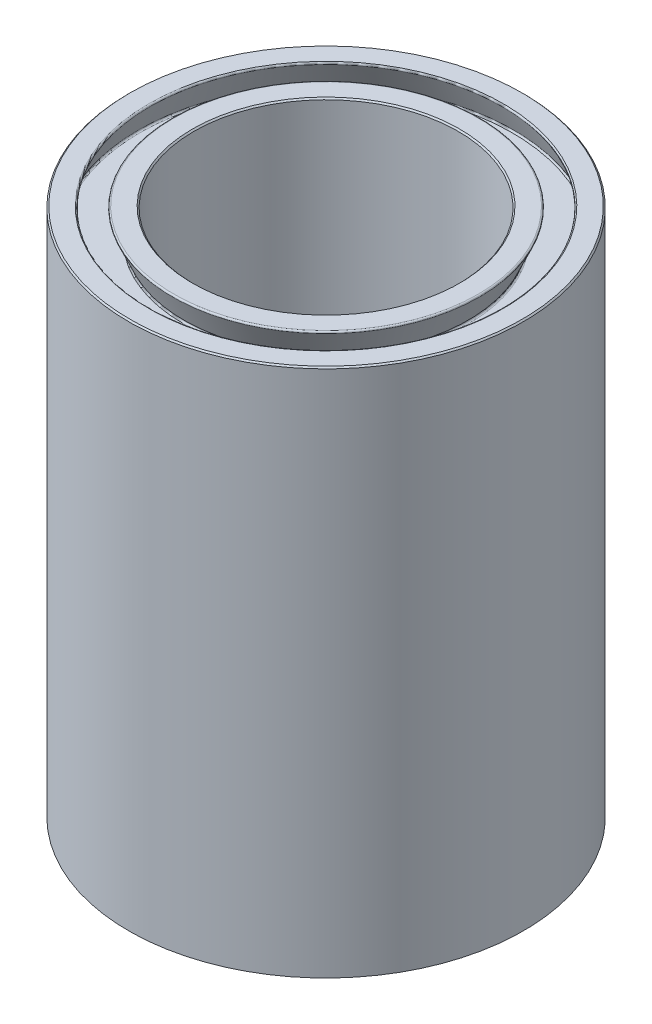
ISO-10303-21;
HEADER;
FILE_DESCRIPTION(('STEP AP214'),'2;1');
FILE_NAME('part.step','',(''),(''),'','','');
FILE_SCHEMA(('AUTOMOTIVE_DESIGN { 1 0 10303 214 1 1 1 1 }'));
ENDSEC;
DATA;
#1=APPLICATION_CONTEXT('core data for automotive mechanical design processes');
#2=APPLICATION_PROTOCOL_DEFINITION('international standard','automotive_design',2000,#1);
#3=PRODUCT_CONTEXT('',#1,'mechanical');
#4=PRODUCT('Part','Part','',(#3));
#5=PRODUCT_RELATED_PRODUCT_CATEGORY('part','',(#4));
#6=PRODUCT_DEFINITION_FORMATION('','',#4);
#7=PRODUCT_DEFINITION_CONTEXT('part definition',#1,'design');
#8=PRODUCT_DEFINITION('design','',#6,#7);
#9=PRODUCT_DEFINITION_SHAPE('','',#8);
#10=(LENGTH_UNIT() NAMED_UNIT(*) SI_UNIT(.MILLI.,.METRE.));
#11=(NAMED_UNIT(*) PLANE_ANGLE_UNIT() SI_UNIT($,.RADIAN.));
#12=(NAMED_UNIT(*) SI_UNIT($,.STERADIAN.) SOLID_ANGLE_UNIT());
#13=UNCERTAINTY_MEASURE_WITH_UNIT(LENGTH_MEASURE(1.E-05),#10,'distance_accuracy_value','');
#14=(GEOMETRIC_REPRESENTATION_CONTEXT(3) GLOBAL_UNCERTAINTY_ASSIGNED_CONTEXT((#13)) GLOBAL_UNIT_ASSIGNED_CONTEXT((#10,
#11,#12)) REPRESENTATION_CONTEXT('',''));
#15=CARTESIAN_POINT('',(0.,0.,0.));
#16=DIRECTION('',(0.,0.,1.));
#17=DIRECTION('',(1.,0.,0.));
#18=AXIS2_PLACEMENT_3D('',#15,#16,#17);
#19=CARTESIAN_POINT('',(-12.7,9.525,0.));
#20=DIRECTION('',(0.,1.,0.));
#21=DIRECTION('',(-1.,0.,0.));
#22=AXIS2_PLACEMENT_3D('',#19,#20,#21);
#23=PLANE('',#22);
#24=CARTESIAN_POINT('',(0.,9.525,0.));
#25=DIRECTION('',(0.,1.,0.));
#26=DIRECTION('',(-1.,0.,0.));
#27=AXIS2_PLACEMENT_3D('',#24,#25,#26);
#28=CIRCLE('',#27,12.7);
#29=CARTESIAN_POINT('',(-12.7,9.525,0.));
#30=VERTEX_POINT('',#29);
#31=EDGE_CURVE('E96',#30,#30,#28,.T.);
#32=ORIENTED_EDGE('',*,*,#31,.T.);
#33=EDGE_LOOP('',(#32));
#34=FACE_BOUND('',#33,.T.);
#35=ADVANCED_FACE('F39',(#34),#23,.T.);
#36=CARTESIAN_POINT('',(0.,34.925,0.));
#37=DIRECTION('',(0.,1.,0.));
#38=DIRECTION('',(-1.,0.,0.));
#39=AXIS2_PLACEMENT_3D('',#36,#37,#38);
#40=DEGENERATE_TOROIDAL_SURFACE('',#39,12.7,25.4,.T.);
#41=CARTESIAN_POINT('',(0.,34.925,0.));
#42=DIRECTION('',(0.,1.,0.));
#43=DIRECTION('',(-1.,0.,0.));
#44=AXIS2_PLACEMENT_3D('',#41,#42,#43);
#45=CIRCLE('',#44,38.1);
#46=CARTESIAN_POINT('',(-38.1,34.925,0.));
#47=VERTEX_POINT('',#46);
#48=EDGE_CURVE('E99',#47,#47,#45,.T.);
#49=ORIENTED_EDGE('',*,*,#48,.T.);
#50=EDGE_LOOP('',(#49));
#51=FACE_BOUND('',#50,.T.);
#52=ORIENTED_EDGE('',*,*,#31,.F.);
#53=EDGE_LOOP('',(#52));
#54=FACE_BOUND('',#53,.T.);
#55=ADVANCED_FACE('F122',(#51,#54),#40,.F.);
#56=CARTESIAN_POINT('',(0.,9.525,0.));
#57=DIRECTION('',(0.,1.,0.));
#58=DIRECTION('',(-1.,0.,0.));
#59=AXIS2_PLACEMENT_3D('',#56,#57,#58);
#60=CYLINDRICAL_SURFACE('',#59,38.1);
#61=CARTESIAN_POINT('',(0.,152.003125,0.));
#62=DIRECTION('',(0.,1.,0.));
#63=DIRECTION('',(-1.,0.,0.));
#64=AXIS2_PLACEMENT_3D('',#61,#62,#63);
#65=CIRCLE('',#64,38.1);
#66=CARTESIAN_POINT('',(-38.1,152.003125,0.));
#67=VERTEX_POINT('',#66);
#68=EDGE_CURVE('E59',#67,#67,#65,.T.);
#69=ORIENTED_EDGE('',*,*,#68,.T.);
#70=EDGE_LOOP('',(#69));
#71=FACE_BOUND('',#70,.T.);
#72=ORIENTED_EDGE('',*,*,#48,.F.);
#73=EDGE_LOOP('',(#72));
#74=FACE_BOUND('',#73,.T.);
#75=ADVANCED_FACE('F128',(#71,#74),#60,.F.);
#76=CARTESIAN_POINT('',(-44.5135,152.4,0.));
#77=DIRECTION('',(0.,1.,0.));
#78=DIRECTION('',(-1.,0.,0.));
#79=AXIS2_PLACEMENT_3D('',#76,#77,#78);
#80=PLANE('',#79);
#81=CARTESIAN_POINT('',(0.,152.4,0.));
#82=DIRECTION('',(0.,1.,0.));
#83=DIRECTION('',(-1.,0.,0.));
#84=AXIS2_PLACEMENT_3D('',#81,#82,#83);
#85=CIRCLE('',#84,38.496875);
#86=CARTESIAN_POINT('',(-38.496875,152.4,0.));
#87=VERTEX_POINT('',#86);
#88=EDGE_CURVE('E53',#87,#87,#85,.F.);
#89=ORIENTED_EDGE('',*,*,#88,.T.);
#90=EDGE_LOOP('',(#89));
#91=FACE_BOUND('',#90,.T.);
#92=CARTESIAN_POINT('',(0.,152.4,0.));
#93=DIRECTION('',(0.,1.,0.));
#94=DIRECTION('',(-1.,0.,0.));
#95=AXIS2_PLACEMENT_3D('',#92,#93,#94);
#96=CIRCLE('',#95,43.9023660924861);
#97=CARTESIAN_POINT('',(-43.9023660924861,152.4,0.));
#98=VERTEX_POINT('',#97);
#99=EDGE_CURVE('E65',#98,#98,#96,.T.);
#100=ORIENTED_EDGE('',*,*,#99,.T.);
#101=EDGE_LOOP('',(#100));
#102=FACE_BOUND('',#101,.T.);
#103=ADVANCED_FACE('F159',(#91,#102),#80,.T.);
#104=CARTESIAN_POINT('',(0.,152.4,0.));
#105=DIRECTION('',(0.,1.,0.));
#106=DIRECTION('',(-1.,0.,0.));
#107=AXIS2_PLACEMENT_3D('',#104,#105,#106);
#108=CONICAL_SURFACE('',#107,44.5135,0.418879020478643);
#109=CARTESIAN_POINT('',(0.,144.385798605221,0.));
#110=DIRECTION('',(0.,1.,0.));
#111=DIRECTION('',(-1.,0.,0.));
#112=AXIS2_PLACEMENT_3D('',#109,#110,#111);
#113=CIRCLE('',#112,40.9453476492045);
#114=CARTESIAN_POINT('',(-40.9453476492045,144.385798605221,0.));
#115=VERTEX_POINT('',#114);
#116=EDGE_CURVE('E88',#115,#115,#113,.T.);
#117=ORIENTED_EDGE('',*,*,#116,.T.);
#118=EDGE_LOOP('',(#117));
#119=FACE_BOUND('',#118,.T.);
#120=CARTESIAN_POINT('',(0.,151.841701394779,0.));
#121=DIRECTION('',(0.,-1.,0.));
#122=DIRECTION('',(1.,0.,0.));
#123=AXIS2_PLACEMENT_3D('',#120,#121,#122);
#124=CIRCLE('',#123,44.264929445988);
#125=CARTESIAN_POINT('',(44.264929445988,151.841701394779,0.));
#126=VERTEX_POINT('',#125);
#127=EDGE_CURVE('E92',#126,#126,#124,.T.);
#128=ORIENTED_EDGE('',*,*,#127,.T.);
#129=EDGE_LOOP('',(#128));
#130=FACE_BOUND('',#129,.T.);
#131=ADVANCED_FACE('F166',(#119,#130),#108,.T.);
#132=CARTESIAN_POINT('',(-54.2992229048075,143.8275,0.));
#133=DIRECTION('',(0.,1.,0.));
#134=DIRECTION('',(-1.,0.,0.));
#135=AXIS2_PLACEMENT_3D('',#132,#133,#134);
#136=PLANE('',#135);
#137=CARTESIAN_POINT('',(0.,143.8275,0.));
#138=DIRECTION('',(0.,1.,0.));
#139=DIRECTION('',(-1.,0.,0.));
#140=AXIS2_PLACEMENT_3D('',#137,#138,#139);
#141=CIRCLE('',#140,41.3079110027064);
#142=CARTESIAN_POINT('',(-41.3079110027064,143.8275,0.));
#143=VERTEX_POINT('',#142);
#144=EDGE_CURVE('E80',#143,#143,#141,.F.);
#145=ORIENTED_EDGE('',*,*,#144,.T.);
#146=EDGE_LOOP('',(#145));
#147=FACE_BOUND('',#146,.T.);
#148=CARTESIAN_POINT('',(0.,143.8275,0.));
#149=DIRECTION('',(0.,1.,0.));
#150=DIRECTION('',(-1.,0.,0.));
#151=AXIS2_PLACEMENT_3D('',#148,#149,#150);
#152=CIRCLE('',#151,53.6880889972936);
#153=CARTESIAN_POINT('',(-53.6880889972936,143.8275,0.));
#154=VERTEX_POINT('',#153);
#155=EDGE_CURVE('E84',#154,#154,#152,.T.);
#156=ORIENTED_EDGE('',*,*,#155,.T.);
#157=EDGE_LOOP('',(#156));
#158=FACE_BOUND('',#157,.T.);
#159=ADVANCED_FACE('F172',(#147,#158),#136,.T.);
#160=CARTESIAN_POINT('',(0.,143.8275,0.));
#161=DIRECTION('',(0.,-1.,0.));
#162=DIRECTION('',(1.,0.,0.));
#163=AXIS2_PLACEMENT_3D('',#160,#161,#162);
#164=CONICAL_SURFACE('',#163,54.2992229048075,0.418879020478645);
#165=CARTESIAN_POINT('',(0.,151.841701394779,0.));
#166=DIRECTION('',(0.,1.,0.));
#167=DIRECTION('',(-1.,0.,0.));
#168=AXIS2_PLACEMENT_3D('',#165,#166,#167);
#169=CIRCLE('',#168,50.731070554012);
#170=CARTESIAN_POINT('',(-50.731070554012,151.841701394779,0.));
#171=VERTEX_POINT('',#170);
#172=EDGE_CURVE('E73',#171,#171,#169,.T.);
#173=ORIENTED_EDGE('',*,*,#172,.T.);
#174=EDGE_LOOP('',(#173));
#175=FACE_BOUND('',#174,.T.);
#176=CARTESIAN_POINT('',(0.,144.385798605221,0.));
#177=DIRECTION('',(0.,-1.,0.));
#178=DIRECTION('',(1.,0.,0.));
#179=AXIS2_PLACEMENT_3D('',#176,#177,#178);
#180=CIRCLE('',#179,54.0506523507955);
#181=CARTESIAN_POINT('',(54.0506523507955,144.385798605221,0.));
#182=VERTEX_POINT('',#181);
#183=EDGE_CURVE('E77',#182,#182,#180,.T.);
#184=ORIENTED_EDGE('',*,*,#183,.T.);
#185=EDGE_LOOP('',(#184));
#186=FACE_BOUND('',#185,.T.);
#187=ADVANCED_FACE('F176',(#175,#186),#164,.F.);
#188=CARTESIAN_POINT('',(-56.896,152.4,0.));
#189=DIRECTION('',(0.,1.,0.));
#190=DIRECTION('',(-1.,0.,0.));
#191=AXIS2_PLACEMENT_3D('',#188,#189,#190);
#192=PLANE('',#191);
#193=CARTESIAN_POINT('',(0.,152.4,0.));
#194=DIRECTION('',(0.,1.,0.));
#195=DIRECTION('',(-1.,0.,0.));
#196=AXIS2_PLACEMENT_3D('',#193,#194,#195);
#197=CIRCLE('',#196,56.499125);
#198=CARTESIAN_POINT('',(-56.499125,152.4,0.));
#199=VERTEX_POINT('',#198);
#200=EDGE_CURVE('E48',#199,#199,#197,.T.);
#201=ORIENTED_EDGE('',*,*,#200,.T.);
#202=EDGE_LOOP('',(#201));
#203=FACE_BOUND('',#202,.T.);
#204=CARTESIAN_POINT('',(0.,152.4,0.));
#205=DIRECTION('',(0.,1.,0.));
#206=DIRECTION('',(-1.,0.,0.));
#207=AXIS2_PLACEMENT_3D('',#204,#205,#206);
#208=CIRCLE('',#207,51.0936339075139);
#209=CARTESIAN_POINT('',(-51.0936339075139,152.4,0.));
#210=VERTEX_POINT('',#209);
#211=EDGE_CURVE('E69',#210,#210,#208,.F.);
#212=ORIENTED_EDGE('',*,*,#211,.T.);
#213=EDGE_LOOP('',(#212));
#214=FACE_BOUND('',#213,.T.);
#215=ADVANCED_FACE('F119',(#203,#214),#192,.T.);
#216=CARTESIAN_POINT('',(0.,9.525,0.));
#217=DIRECTION('',(0.,1.,0.));
#218=DIRECTION('',(-1.,0.,0.));
#219=AXIS2_PLACEMENT_3D('',#216,#217,#218);
#220=CYLINDRICAL_SURFACE('',#219,56.896);
#221=CARTESIAN_POINT('',(0.,152.003125,0.));
#222=DIRECTION('',(0.,1.,0.));
#223=DIRECTION('',(-1.,0.,0.));
#224=AXIS2_PLACEMENT_3D('',#221,#222,#223);
#225=CIRCLE('',#224,56.896);
#226=CARTESIAN_POINT('',(-56.896,152.003125,0.));
#227=VERTEX_POINT('',#226);
#228=EDGE_CURVE('E10',#227,#227,#225,.F.);
#229=ORIENTED_EDGE('',*,*,#228,.T.);
#230=EDGE_LOOP('',(#229));
#231=FACE_BOUND('',#230,.T.);
#232=CARTESIAN_POINT('',(0.,0.,0.));
#233=DIRECTION('',(0.,1.,0.));
#234=DIRECTION('',(-1.,0.,0.));
#235=AXIS2_PLACEMENT_3D('',#232,#233,#234);
#236=CIRCLE('',#235,56.896);
#237=CARTESIAN_POINT('',(-56.896,0.,0.));
#238=VERTEX_POINT('',#237);
#239=EDGE_CURVE('E102',#238,#238,#236,.T.);
#240=ORIENTED_EDGE('',*,*,#239,.T.);
#241=EDGE_LOOP('',(#240));
#242=FACE_BOUND('',#241,.T.);
#243=ADVANCED_FACE('F106',(#231,#242),#220,.T.);
#244=CARTESIAN_POINT('',(0.,0.,0.));
#245=DIRECTION('',(0.,-1.,0.));
#246=DIRECTION('',(1.,0.,0.));
#247=AXIS2_PLACEMENT_3D('',#244,#245,#246);
#248=PLANE('',#247);
#249=ORIENTED_EDGE('',*,*,#239,.F.);
#250=EDGE_LOOP('',(#249));
#251=FACE_BOUND('',#250,.T.);
#252=ADVANCED_FACE('F108',(#251),#248,.T.);
#253=CARTESIAN_POINT('',(0.,144.224375,0.));
#254=DIRECTION('',(0.,1.,0.));
#255=DIRECTION('',(-1.,0.,0.));
#256=AXIS2_PLACEMENT_3D('',#253,#254,#255);
#257=TOROIDAL_SURFACE('',#256,41.3079110027064,0.396875);
#258=ORIENTED_EDGE('',*,*,#144,.F.);
#259=EDGE_LOOP('',(#258));
#260=FACE_BOUND('',#259,.T.);
#261=ORIENTED_EDGE('',*,*,#116,.F.);
#262=EDGE_LOOP('',(#261));
#263=FACE_BOUND('',#262,.T.);
#264=ADVANCED_FACE('F110',(#260,#263),#257,.F.);
#265=CARTESIAN_POINT('',(0.,152.003125,0.));
#266=DIRECTION('',(0.,1.,0.));
#267=DIRECTION('',(-1.,0.,0.));
#268=AXIS2_PLACEMENT_3D('',#265,#266,#267);
#269=TOROIDAL_SURFACE('',#268,51.0936339075139,0.396875);
#270=ORIENTED_EDGE('',*,*,#211,.F.);
#271=EDGE_LOOP('',(#270));
#272=FACE_BOUND('',#271,.T.);
#273=ORIENTED_EDGE('',*,*,#172,.F.);
#274=EDGE_LOOP('',(#273));
#275=FACE_BOUND('',#274,.T.);
#276=ADVANCED_FACE('F116',(#272,#275),#269,.T.);
#277=CARTESIAN_POINT('',(0.,144.224375,0.));
#278=DIRECTION('',(0.,1.,0.));
#279=DIRECTION('',(-1.,0.,0.));
#280=AXIS2_PLACEMENT_3D('',#277,#278,#279);
#281=TOROIDAL_SURFACE('',#280,53.6880889972936,0.396875);
#282=ORIENTED_EDGE('',*,*,#183,.F.);
#283=EDGE_LOOP('',(#282));
#284=FACE_BOUND('',#283,.T.);
#285=ORIENTED_EDGE('',*,*,#155,.F.);
#286=EDGE_LOOP('',(#285));
#287=FACE_BOUND('',#286,.T.);
#288=ADVANCED_FACE('F135',(#284,#287),#281,.F.);
#289=CARTESIAN_POINT('',(0.,152.003125,0.));
#290=DIRECTION('',(0.,1.,0.));
#291=DIRECTION('',(-1.,0.,0.));
#292=AXIS2_PLACEMENT_3D('',#289,#290,#291);
#293=TOROIDAL_SURFACE('',#292,43.9023660924861,0.396875);
#294=ORIENTED_EDGE('',*,*,#127,.F.);
#295=EDGE_LOOP('',(#294));
#296=FACE_BOUND('',#295,.T.);
#297=ORIENTED_EDGE('',*,*,#99,.F.);
#298=EDGE_LOOP('',(#297));
#299=FACE_BOUND('',#298,.T.);
#300=ADVANCED_FACE('F139',(#296,#299),#293,.T.);
#301=CARTESIAN_POINT('',(0.,152.003125,0.));
#302=DIRECTION('',(0.,1.,0.));
#303=DIRECTION('',(-1.,0.,0.));
#304=AXIS2_PLACEMENT_3D('',#301,#302,#303);
#305=CONICAL_SURFACE('',#304,38.1,0.785398163397396);
#306=ORIENTED_EDGE('',*,*,#88,.F.);
#307=EDGE_LOOP('',(#306));
#308=FACE_BOUND('',#307,.T.);
#309=ORIENTED_EDGE('',*,*,#68,.F.);
#310=EDGE_LOOP('',(#309));
#311=FACE_BOUND('',#310,.T.);
#312=ADVANCED_FACE('F142',(#308,#311),#305,.F.);
#313=CARTESIAN_POINT('',(0.,152.4,0.));
#314=DIRECTION('',(0.,-1.,0.));
#315=DIRECTION('',(1.,0.,0.));
#316=AXIS2_PLACEMENT_3D('',#313,#314,#315);
#317=CONICAL_SURFACE('',#316,56.499125,0.785398163397492);
#318=ORIENTED_EDGE('',*,*,#228,.F.);
#319=EDGE_LOOP('',(#318));
#320=FACE_BOUND('',#319,.T.);
#321=ORIENTED_EDGE('',*,*,#200,.F.);
#322=EDGE_LOOP('',(#321));
#323=FACE_BOUND('',#322,.T.);
#324=ADVANCED_FACE('F42',(#320,#323),#317,.T.);
#325=CLOSED_SHELL('',(#35,#55,#75,#103,#131,#159,#187,#215,#243,#252,#264,#276,#288,#300,#312,#324));
#326=MANIFOLD_SOLID_BREP('B2',#325);
#327=ADVANCED_BREP_SHAPE_REPRESENTATION('',(#18,#326),#14);
#328=SHAPE_DEFINITION_REPRESENTATION(#9,#327);
ENDSEC;
END-ISO-10303-21;
